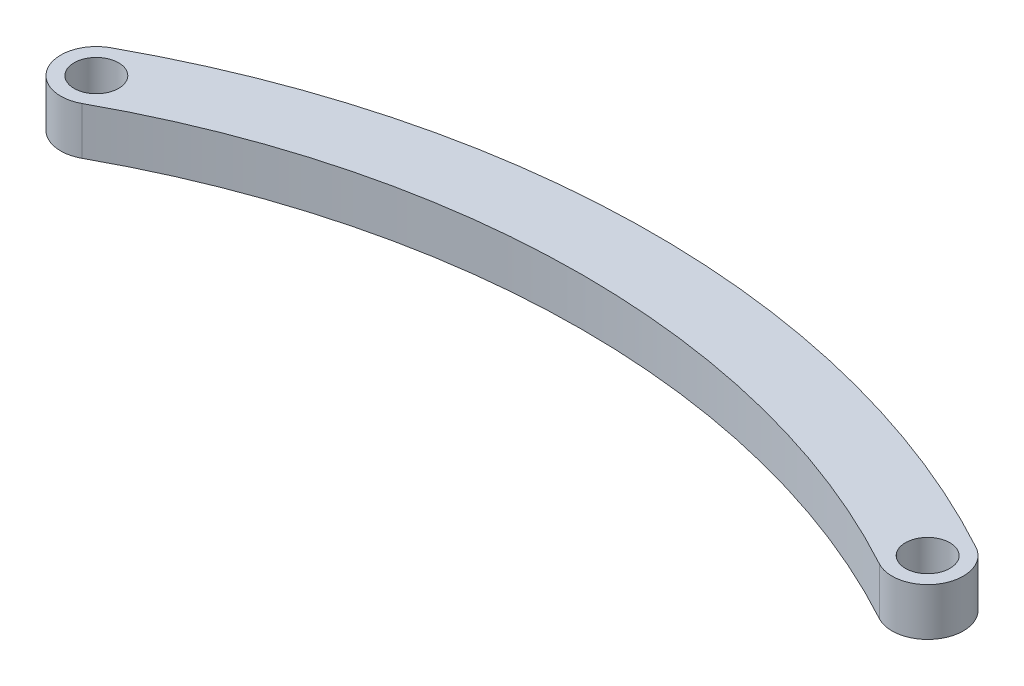
ISO-10303-21;
HEADER;
FILE_DESCRIPTION(('STEP AP214'),'2;1');
FILE_NAME('part.step','',(''),(''),'','','');
FILE_SCHEMA(('AUTOMOTIVE_DESIGN { 1 0 10303 214 1 1 1 1 }'));
ENDSEC;
DATA;
#1=APPLICATION_CONTEXT('core data for automotive mechanical design processes');
#2=APPLICATION_PROTOCOL_DEFINITION('international standard','automotive_design',2000,#1);
#3=PRODUCT_CONTEXT('',#1,'mechanical');
#4=PRODUCT('Part','Part','',(#3));
#5=PRODUCT_RELATED_PRODUCT_CATEGORY('part','',(#4));
#6=PRODUCT_DEFINITION_FORMATION('','',#4);
#7=PRODUCT_DEFINITION_CONTEXT('part definition',#1,'design');
#8=PRODUCT_DEFINITION('design','',#6,#7);
#9=PRODUCT_DEFINITION_SHAPE('','',#8);
#10=(LENGTH_UNIT() NAMED_UNIT(*) SI_UNIT(.MILLI.,.METRE.));
#11=(NAMED_UNIT(*) PLANE_ANGLE_UNIT() SI_UNIT($,.RADIAN.));
#12=(NAMED_UNIT(*) SI_UNIT($,.STERADIAN.) SOLID_ANGLE_UNIT());
#13=UNCERTAINTY_MEASURE_WITH_UNIT(LENGTH_MEASURE(1.E-05),#10,'distance_accuracy_value','');
#14=(GEOMETRIC_REPRESENTATION_CONTEXT(3) GLOBAL_UNCERTAINTY_ASSIGNED_CONTEXT((#13)) GLOBAL_UNIT_ASSIGNED_CONTEXT((#10,
#11,#12)) REPRESENTATION_CONTEXT('',''));
#15=CARTESIAN_POINT('',(0.,0.,0.));
#16=DIRECTION('',(0.,0.,1.));
#17=DIRECTION('',(1.,0.,0.));
#18=AXIS2_PLACEMENT_3D('',#15,#16,#17);
#19=CARTESIAN_POINT('',(0.,4.,64.0624695121879));
#20=DIRECTION('',(0.,-1.,0.));
#21=DIRECTION('',(0.,0.,-1.));
#22=AXIS2_PLACEMENT_3D('',#19,#20,#21);
#23=CYLINDRICAL_SURFACE('',#22,70.);
#24=CARTESIAN_POINT('',(0.,0.,64.0624695121879));
#25=DIRECTION('',(0.,1.,0.));
#26=DIRECTION('',(0.,0.,1.));
#27=AXIS2_PLACEMENT_3D('',#24,#25,#26);
#28=CIRCLE('',#27,70.);
#29=CARTESIAN_POINT('',(33.5616438356164,0.,2.63270422652827));
#30=VERTEX_POINT('',#29);
#31=CARTESIAN_POINT('',(-33.5616438356164,0.,2.63270422652827));
#32=VERTEX_POINT('',#31);
#33=EDGE_CURVE('E103',#30,#32,#28,.T.);
#34=ORIENTED_EDGE('',*,*,#33,.F.);
#35=DIRECTION('',(0.,-1.,0.));
#36=VECTOR('',#35,1.);
#37=CARTESIAN_POINT('',(33.5616438356164,4.,2.63270422652827));
#38=LINE('',#37,#36);
#39=CARTESIAN_POINT('',(33.5616438356164,4.,2.63270422652827));
#40=VERTEX_POINT('',#39);
#41=EDGE_CURVE('E11',#40,#30,#38,.T.);
#42=ORIENTED_EDGE('',*,*,#41,.F.);
#43=CARTESIAN_POINT('',(0.,4.,64.0624695121879));
#44=DIRECTION('',(0.,1.,0.));
#45=DIRECTION('',(0.,0.,1.));
#46=AXIS2_PLACEMENT_3D('',#43,#44,#45);
#47=CIRCLE('',#46,70.);
#48=CARTESIAN_POINT('',(-33.5616438356164,4.,2.63270422652827));
#49=VERTEX_POINT('',#48);
#50=EDGE_CURVE('E85',#40,#49,#47,.T.);
#51=ORIENTED_EDGE('',*,*,#50,.T.);
#52=DIRECTION('',(0.,-1.,0.));
#53=VECTOR('',#52,1.);
#54=CARTESIAN_POINT('',(-33.5616438356164,4.,2.63270422652827));
#55=LINE('',#54,#53);
#56=EDGE_CURVE('E73',#49,#32,#55,.T.);
#57=ORIENTED_EDGE('',*,*,#56,.T.);
#58=EDGE_LOOP('',(#34,#42,#51,#57));
#59=FACE_BOUND('',#58,.T.);
#60=ADVANCED_FACE('F34',(#59),#23,.F.);
#61=CARTESIAN_POINT('',(35.,4.,0.));
#62=DIRECTION('',(0.,-1.,0.));
#63=DIRECTION('',(0.,0.,-1.));
#64=AXIS2_PLACEMENT_3D('',#61,#62,#63);
#65=CYLINDRICAL_SURFACE('',#64,3.);
#66=CARTESIAN_POINT('',(35.,0.,0.));
#67=DIRECTION('',(0.,1.,0.));
#68=DIRECTION('',(0.,0.,1.));
#69=AXIS2_PLACEMENT_3D('',#66,#67,#68);
#70=CIRCLE('',#69,3.);
#71=CARTESIAN_POINT('',(36.4383561643836,0.,-2.63270422652827));
#72=VERTEX_POINT('',#71);
#73=EDGE_CURVE('E90',#30,#72,#70,.T.);
#74=ORIENTED_EDGE('',*,*,#73,.T.);
#75=DIRECTION('',(0.,-1.,0.));
#76=VECTOR('',#75,1.);
#77=CARTESIAN_POINT('',(36.4383561643836,4.,-2.63270422652827));
#78=LINE('',#77,#76);
#79=CARTESIAN_POINT('',(36.4383561643836,4.,-2.63270422652827));
#80=VERTEX_POINT('',#79);
#81=EDGE_CURVE('E42',#80,#72,#78,.T.);
#82=ORIENTED_EDGE('',*,*,#81,.F.);
#83=CARTESIAN_POINT('',(35.,4.,0.));
#84=DIRECTION('',(0.,1.,0.));
#85=DIRECTION('',(0.,0.,1.));
#86=AXIS2_PLACEMENT_3D('',#83,#84,#85);
#87=CIRCLE('',#86,3.);
#88=EDGE_CURVE('E79',#40,#80,#87,.T.);
#89=ORIENTED_EDGE('',*,*,#88,.F.);
#90=ORIENTED_EDGE('',*,*,#41,.T.);
#91=EDGE_LOOP('',(#74,#82,#89,#90));
#92=FACE_BOUND('',#91,.T.);
#93=ADVANCED_FACE('F88',(#92),#65,.T.);
#94=CARTESIAN_POINT('',(0.,4.,64.0624695121879));
#95=DIRECTION('',(0.,-1.,0.));
#96=DIRECTION('',(0.,0.,-1.));
#97=AXIS2_PLACEMENT_3D('',#94,#95,#96);
#98=CYLINDRICAL_SURFACE('',#97,76.);
#99=CARTESIAN_POINT('',(0.,0.,64.0624695121879));
#100=DIRECTION('',(0.,1.,0.));
#101=DIRECTION('',(0.,0.,1.));
#102=AXIS2_PLACEMENT_3D('',#99,#100,#101);
#103=CIRCLE('',#102,76.);
#104=CARTESIAN_POINT('',(-36.4383561643836,0.,-2.63270422652827));
#105=VERTEX_POINT('',#104);
#106=EDGE_CURVE('E66',#72,#105,#103,.T.);
#107=ORIENTED_EDGE('',*,*,#106,.T.);
#108=DIRECTION('',(0.,-1.,0.));
#109=VECTOR('',#108,1.);
#110=CARTESIAN_POINT('',(-36.4383561643836,4.,-2.63270422652827));
#111=LINE('',#110,#109);
#112=CARTESIAN_POINT('',(-36.4383561643836,4.,-2.63270422652827));
#113=VERTEX_POINT('',#112);
#114=EDGE_CURVE('E91',#113,#105,#111,.T.);
#115=ORIENTED_EDGE('',*,*,#114,.F.);
#116=CARTESIAN_POINT('',(0.,4.,64.0624695121879));
#117=DIRECTION('',(0.,1.,0.));
#118=DIRECTION('',(0.,0.,1.));
#119=AXIS2_PLACEMENT_3D('',#116,#117,#118);
#120=CIRCLE('',#119,76.);
#121=EDGE_CURVE('E84',#80,#113,#120,.T.);
#122=ORIENTED_EDGE('',*,*,#121,.F.);
#123=ORIENTED_EDGE('',*,*,#81,.T.);
#124=EDGE_LOOP('',(#107,#115,#122,#123));
#125=FACE_BOUND('',#124,.T.);
#126=ADVANCED_FACE('F92',(#125),#98,.T.);
#127=CARTESIAN_POINT('',(-35.,4.,0.));
#128=DIRECTION('',(0.,-1.,0.));
#129=DIRECTION('',(0.,0.,-1.));
#130=AXIS2_PLACEMENT_3D('',#127,#128,#129);
#131=CYLINDRICAL_SURFACE('',#130,1.875);
#132=CARTESIAN_POINT('',(-35.,4.,0.));
#133=DIRECTION('',(0.,1.,0.));
#134=DIRECTION('',(0.,0.,1.));
#135=AXIS2_PLACEMENT_3D('',#132,#133,#134);
#136=CIRCLE('',#135,1.875);
#137=CARTESIAN_POINT('',(-35.,4.,1.875));
#138=VERTEX_POINT('',#137);
#139=EDGE_CURVE('E94',#138,#138,#136,.T.);
#140=ORIENTED_EDGE('',*,*,#139,.T.);
#141=EDGE_LOOP('',(#140));
#142=FACE_BOUND('',#141,.T.);
#143=CARTESIAN_POINT('',(-35.,0.,0.));
#144=DIRECTION('',(0.,1.,0.));
#145=DIRECTION('',(0.,0.,1.));
#146=AXIS2_PLACEMENT_3D('',#143,#144,#145);
#147=CIRCLE('',#146,1.875);
#148=CARTESIAN_POINT('',(-35.,0.,1.875));
#149=VERTEX_POINT('',#148);
#150=EDGE_CURVE('E110',#149,#149,#147,.T.);
#151=ORIENTED_EDGE('',*,*,#150,.F.);
#152=EDGE_LOOP('',(#151));
#153=FACE_BOUND('',#152,.T.);
#154=ADVANCED_FACE('F130',(#142,#153),#131,.F.);
#155=CARTESIAN_POINT('',(-35.,4.,0.));
#156=DIRECTION('',(0.,-1.,0.));
#157=DIRECTION('',(0.,0.,-1.));
#158=AXIS2_PLACEMENT_3D('',#155,#156,#157);
#159=CYLINDRICAL_SURFACE('',#158,3.);
#160=CARTESIAN_POINT('',(-35.,0.,0.));
#161=DIRECTION('',(0.,1.,0.));
#162=DIRECTION('',(0.,0.,1.));
#163=AXIS2_PLACEMENT_3D('',#160,#161,#162);
#164=CIRCLE('',#163,3.);
#165=EDGE_CURVE('E108',#105,#32,#164,.T.);
#166=ORIENTED_EDGE('',*,*,#165,.T.);
#167=ORIENTED_EDGE('',*,*,#56,.F.);
#168=CARTESIAN_POINT('',(-35.,4.,0.));
#169=DIRECTION('',(0.,1.,0.));
#170=DIRECTION('',(0.,0.,1.));
#171=AXIS2_PLACEMENT_3D('',#168,#169,#170);
#172=CIRCLE('',#171,3.);
#173=EDGE_CURVE('E50',#113,#49,#172,.T.);
#174=ORIENTED_EDGE('',*,*,#173,.F.);
#175=ORIENTED_EDGE('',*,*,#114,.T.);
#176=EDGE_LOOP('',(#166,#167,#174,#175));
#177=FACE_BOUND('',#176,.T.);
#178=ADVANCED_FACE('F119',(#177),#159,.T.);
#179=CARTESIAN_POINT('',(35.,4.,0.));
#180=DIRECTION('',(0.,-1.,0.));
#181=DIRECTION('',(0.,0.,-1.));
#182=AXIS2_PLACEMENT_3D('',#179,#180,#181);
#183=CYLINDRICAL_SURFACE('',#182,1.875);
#184=CARTESIAN_POINT('',(35.,4.,0.));
#185=DIRECTION('',(0.,1.,0.));
#186=DIRECTION('',(0.,0.,1.));
#187=AXIS2_PLACEMENT_3D('',#184,#185,#186);
#188=CIRCLE('',#187,1.875);
#189=CARTESIAN_POINT('',(35.,4.,1.875));
#190=VERTEX_POINT('',#189);
#191=EDGE_CURVE('E100',#190,#190,#188,.T.);
#192=ORIENTED_EDGE('',*,*,#191,.T.);
#193=EDGE_LOOP('',(#192));
#194=FACE_BOUND('',#193,.T.);
#195=CARTESIAN_POINT('',(35.,0.,0.));
#196=DIRECTION('',(0.,1.,0.));
#197=DIRECTION('',(0.,0.,1.));
#198=AXIS2_PLACEMENT_3D('',#195,#196,#197);
#199=CIRCLE('',#198,1.875);
#200=CARTESIAN_POINT('',(35.,0.,1.875));
#201=VERTEX_POINT('',#200);
#202=EDGE_CURVE('E113',#201,#201,#199,.T.);
#203=ORIENTED_EDGE('',*,*,#202,.F.);
#204=EDGE_LOOP('',(#203));
#205=FACE_BOUND('',#204,.T.);
#206=ADVANCED_FACE('F135',(#194,#205),#183,.F.);
#207=CARTESIAN_POINT('',(0.,4.,0.));
#208=DIRECTION('',(0.,1.,0.));
#209=DIRECTION('',(0.,0.,1.));
#210=AXIS2_PLACEMENT_3D('',#207,#208,#209);
#211=PLANE('',#210);
#212=ORIENTED_EDGE('',*,*,#50,.F.);
#213=ORIENTED_EDGE('',*,*,#88,.T.);
#214=ORIENTED_EDGE('',*,*,#121,.T.);
#215=ORIENTED_EDGE('',*,*,#173,.T.);
#216=EDGE_LOOP('',(#212,#213,#214,#215));
#217=FACE_BOUND('',#216,.T.);
#218=ORIENTED_EDGE('',*,*,#139,.F.);
#219=EDGE_LOOP('',(#218));
#220=FACE_BOUND('',#219,.T.);
#221=ORIENTED_EDGE('',*,*,#191,.F.);
#222=EDGE_LOOP('',(#221));
#223=FACE_BOUND('',#222,.T.);
#224=ADVANCED_FACE('F81',(#217,#220,#223),#211,.T.);
#225=CARTESIAN_POINT('',(0.,0.,0.));
#226=DIRECTION('',(0.,1.,0.));
#227=DIRECTION('',(0.,0.,1.));
#228=AXIS2_PLACEMENT_3D('',#225,#226,#227);
#229=PLANE('',#228);
#230=ORIENTED_EDGE('',*,*,#33,.T.);
#231=ORIENTED_EDGE('',*,*,#165,.F.);
#232=ORIENTED_EDGE('',*,*,#106,.F.);
#233=ORIENTED_EDGE('',*,*,#73,.F.);
#234=EDGE_LOOP('',(#230,#231,#232,#233));
#235=FACE_BOUND('',#234,.T.);
#236=ORIENTED_EDGE('',*,*,#150,.T.);
#237=EDGE_LOOP('',(#236));
#238=FACE_BOUND('',#237,.T.);
#239=ORIENTED_EDGE('',*,*,#202,.T.);
#240=EDGE_LOOP('',(#239));
#241=FACE_BOUND('',#240,.T.);
#242=ADVANCED_FACE('F121',(#235,#238,#241),#229,.F.);
#243=CLOSED_SHELL('',(#60,#93,#126,#154,#178,#206,#224,#242));
#244=MANIFOLD_SOLID_BREP('B2',#243);
#245=ADVANCED_BREP_SHAPE_REPRESENTATION('',(#18,#244),#14);
#246=SHAPE_DEFINITION_REPRESENTATION(#9,#245);
ENDSEC;
END-ISO-10303-21;
